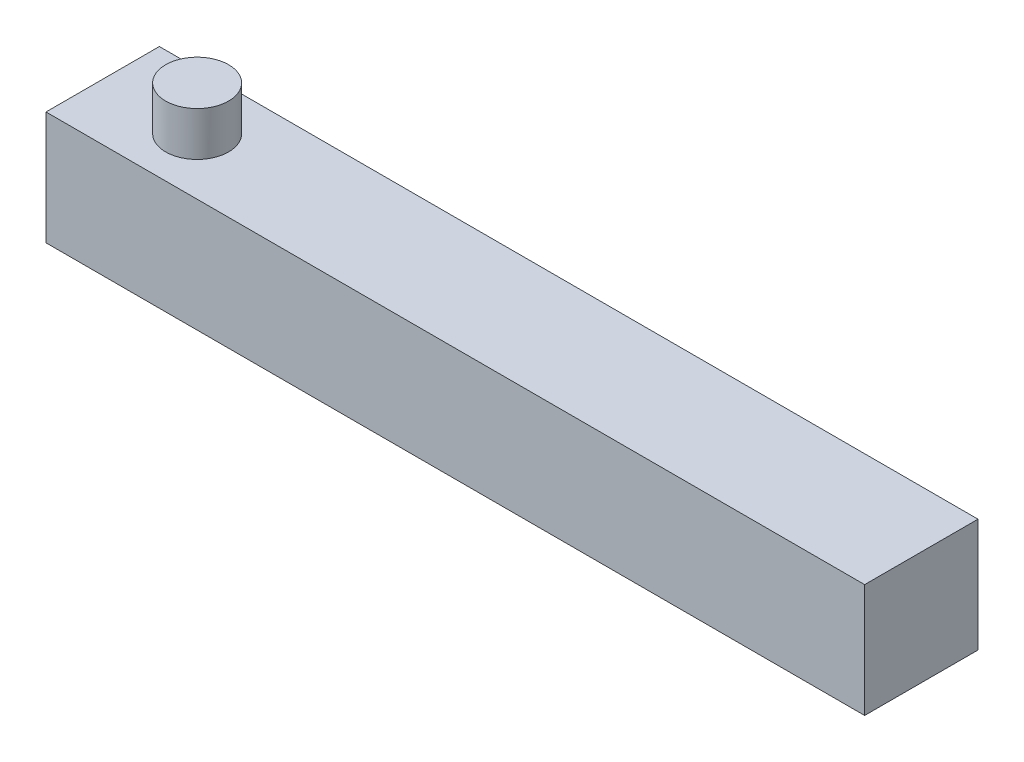
ISO-10303-21;
HEADER;
FILE_DESCRIPTION(('STEP AP214'),'2;1');
FILE_NAME('part.step','',(''),(''),'','','');
FILE_SCHEMA(('AUTOMOTIVE_DESIGN { 1 0 10303 214 1 1 1 1 }'));
ENDSEC;
DATA;
#1=APPLICATION_CONTEXT('core data for automotive mechanical design processes');
#2=APPLICATION_PROTOCOL_DEFINITION('international standard','automotive_design',2000,#1);
#3=PRODUCT_CONTEXT('',#1,'mechanical');
#4=PRODUCT('Part','Part','',(#3));
#5=PRODUCT_RELATED_PRODUCT_CATEGORY('part','',(#4));
#6=PRODUCT_DEFINITION_FORMATION('','',#4);
#7=PRODUCT_DEFINITION_CONTEXT('part definition',#1,'design');
#8=PRODUCT_DEFINITION('design','',#6,#7);
#9=PRODUCT_DEFINITION_SHAPE('','',#8);
#10=(LENGTH_UNIT() NAMED_UNIT(*) SI_UNIT(.MILLI.,.METRE.));
#11=(NAMED_UNIT(*) PLANE_ANGLE_UNIT() SI_UNIT($,.RADIAN.));
#12=(NAMED_UNIT(*) SI_UNIT($,.STERADIAN.) SOLID_ANGLE_UNIT());
#13=UNCERTAINTY_MEASURE_WITH_UNIT(LENGTH_MEASURE(1.E-05),#10,'distance_accuracy_value','');
#14=(GEOMETRIC_REPRESENTATION_CONTEXT(3) GLOBAL_UNCERTAINTY_ASSIGNED_CONTEXT((#13)) GLOBAL_UNIT_ASSIGNED_CONTEXT((#10,
#11,#12)) REPRESENTATION_CONTEXT('',''));
#15=CARTESIAN_POINT('',(0.,0.,0.));
#16=DIRECTION('',(0.,0.,1.));
#17=DIRECTION('',(1.,0.,0.));
#18=AXIS2_PLACEMENT_3D('',#15,#16,#17);
#19=CARTESIAN_POINT('',(32.5,9.,4.5));
#20=DIRECTION('',(-1.,0.,0.));
#21=DIRECTION('',(0.,0.,1.));
#22=AXIS2_PLACEMENT_3D('',#19,#20,#21);
#23=PLANE('',#22);
#24=DIRECTION('',(0.,0.,-1.));
#25=VECTOR('',#24,1.);
#26=CARTESIAN_POINT('',(32.5,0.,4.5));
#27=LINE('',#26,#25);
#28=CARTESIAN_POINT('',(32.5,0.,4.5));
#29=VERTEX_POINT('',#28);
#30=CARTESIAN_POINT('',(32.5,0.,-4.5));
#31=VERTEX_POINT('',#30);
#32=EDGE_CURVE('E103',#29,#31,#27,.T.);
#33=ORIENTED_EDGE('',*,*,#32,.T.);
#34=DIRECTION('',(0.,-1.,0.));
#35=VECTOR('',#34,1.);
#36=CARTESIAN_POINT('',(32.5,9.,-4.5));
#37=LINE('',#36,#35);
#38=CARTESIAN_POINT('',(32.5,9.,-4.5));
#39=VERTEX_POINT('',#38);
#40=EDGE_CURVE('E45',#39,#31,#37,.T.);
#41=ORIENTED_EDGE('',*,*,#40,.F.);
#42=DIRECTION('',(0.,0.,-1.));
#43=VECTOR('',#42,1.);
#44=CARTESIAN_POINT('',(32.5,9.,4.5));
#45=LINE('',#44,#43);
#46=CARTESIAN_POINT('',(32.5,9.,4.5));
#47=VERTEX_POINT('',#46);
#48=EDGE_CURVE('E89',#47,#39,#45,.T.);
#49=ORIENTED_EDGE('',*,*,#48,.F.);
#50=DIRECTION('',(0.,-1.,0.));
#51=VECTOR('',#50,1.);
#52=CARTESIAN_POINT('',(32.5,9.,4.5));
#53=LINE('',#52,#51);
#54=EDGE_CURVE('E99',#47,#29,#53,.T.);
#55=ORIENTED_EDGE('',*,*,#54,.T.);
#56=EDGE_LOOP('',(#33,#41,#49,#55));
#57=FACE_BOUND('',#56,.T.);
#58=ADVANCED_FACE('F37',(#57),#23,.F.);
#59=CARTESIAN_POINT('',(-32.5,9.,-4.5));
#60=DIRECTION('',(0.,0.,1.));
#61=DIRECTION('',(1.,0.,0.));
#62=AXIS2_PLACEMENT_3D('',#59,#60,#61);
#63=PLANE('',#62);
#64=DIRECTION('',(-1.,0.,0.));
#65=VECTOR('',#64,1.);
#66=CARTESIAN_POINT('',(-32.5,0.,-4.5));
#67=LINE('',#66,#65);
#68=CARTESIAN_POINT('',(-32.5,0.,-4.5));
#69=VERTEX_POINT('',#68);
#70=EDGE_CURVE('E94',#31,#69,#67,.T.);
#71=ORIENTED_EDGE('',*,*,#70,.T.);
#72=DIRECTION('',(0.,-1.,0.));
#73=VECTOR('',#72,1.);
#74=CARTESIAN_POINT('',(-32.5,9.,-4.5));
#75=LINE('',#74,#73);
#76=CARTESIAN_POINT('',(-32.5,9.,-4.5));
#77=VERTEX_POINT('',#76);
#78=EDGE_CURVE('E92',#77,#69,#75,.T.);
#79=ORIENTED_EDGE('',*,*,#78,.F.);
#80=DIRECTION('',(-1.,0.,0.));
#81=VECTOR('',#80,1.);
#82=CARTESIAN_POINT('',(-32.5,9.,-4.5));
#83=LINE('',#82,#81);
#84=EDGE_CURVE('E84',#39,#77,#83,.T.);
#85=ORIENTED_EDGE('',*,*,#84,.F.);
#86=ORIENTED_EDGE('',*,*,#40,.T.);
#87=EDGE_LOOP('',(#71,#79,#85,#86));
#88=FACE_BOUND('',#87,.T.);
#89=ADVANCED_FACE('F93',(#88),#63,.F.);
#90=CARTESIAN_POINT('',(-32.5,9.,4.5));
#91=DIRECTION('',(1.,0.,0.));
#92=DIRECTION('',(0.,0.,-1.));
#93=AXIS2_PLACEMENT_3D('',#90,#91,#92);
#94=PLANE('',#93);
#95=DIRECTION('',(0.,0.,1.));
#96=VECTOR('',#95,1.);
#97=CARTESIAN_POINT('',(-32.5,0.,4.5));
#98=LINE('',#97,#96);
#99=CARTESIAN_POINT('',(-32.5,0.,4.5));
#100=VERTEX_POINT('',#99);
#101=EDGE_CURVE('E70',#69,#100,#98,.T.);
#102=ORIENTED_EDGE('',*,*,#101,.T.);
#103=DIRECTION('',(0.,-1.,0.));
#104=VECTOR('',#103,1.);
#105=CARTESIAN_POINT('',(-32.5,9.,4.5));
#106=LINE('',#105,#104);
#107=CARTESIAN_POINT('',(-32.5,9.,4.5));
#108=VERTEX_POINT('',#107);
#109=EDGE_CURVE('E95',#108,#100,#106,.T.);
#110=ORIENTED_EDGE('',*,*,#109,.F.);
#111=DIRECTION('',(0.,0.,1.));
#112=VECTOR('',#111,1.);
#113=CARTESIAN_POINT('',(-32.5,9.,4.5));
#114=LINE('',#113,#112);
#115=EDGE_CURVE('E87',#77,#108,#114,.T.);
#116=ORIENTED_EDGE('',*,*,#115,.F.);
#117=ORIENTED_EDGE('',*,*,#78,.T.);
#118=EDGE_LOOP('',(#102,#110,#116,#117));
#119=FACE_BOUND('',#118,.T.);
#120=ADVANCED_FACE('F97',(#119),#94,.F.);
#121=CARTESIAN_POINT('',(-32.5,9.,4.5));
#122=DIRECTION('',(0.,0.,-1.));
#123=DIRECTION('',(-1.,0.,0.));
#124=AXIS2_PLACEMENT_3D('',#121,#122,#123);
#125=PLANE('',#124);
#126=DIRECTION('',(1.,0.,0.));
#127=VECTOR('',#126,1.);
#128=CARTESIAN_POINT('',(-32.5,0.,4.5));
#129=LINE('',#128,#127);
#130=EDGE_CURVE('E76',#100,#29,#129,.T.);
#131=ORIENTED_EDGE('',*,*,#130,.T.);
#132=ORIENTED_EDGE('',*,*,#54,.F.);
#133=DIRECTION('',(1.,0.,0.));
#134=VECTOR('',#133,1.);
#135=CARTESIAN_POINT('',(-32.5,9.,4.5));
#136=LINE('',#135,#134);
#137=EDGE_CURVE('E53',#108,#47,#136,.T.);
#138=ORIENTED_EDGE('',*,*,#137,.F.);
#139=ORIENTED_EDGE('',*,*,#109,.T.);
#140=EDGE_LOOP('',(#131,#132,#138,#139));
#141=FACE_BOUND('',#140,.T.);
#142=ADVANCED_FACE('F125',(#141),#125,.F.);
#143=CARTESIAN_POINT('',(0.,9.,0.));
#144=DIRECTION('',(0.,-1.,0.));
#145=DIRECTION('',(0.,0.,-1.));
#146=AXIS2_PLACEMENT_3D('',#143,#144,#145);
#147=PLANE('',#146);
#148=CARTESIAN_POINT('',(-25.,9.,0.));
#149=DIRECTION('',(0.,-1.,0.));
#150=DIRECTION('',(0.,0.,-1.));
#151=AXIS2_PLACEMENT_3D('',#148,#149,#150);
#152=CIRCLE('',#151,2.5);
#153=CARTESIAN_POINT('',(-25.,9.,-2.5));
#154=VERTEX_POINT('',#153);
#155=EDGE_CURVE('E11',#154,#154,#152,.F.);
#156=ORIENTED_EDGE('',*,*,#155,.F.);
#157=EDGE_LOOP('',(#156));
#158=FACE_BOUND('',#157,.T.);
#159=ORIENTED_EDGE('',*,*,#48,.T.);
#160=ORIENTED_EDGE('',*,*,#84,.T.);
#161=ORIENTED_EDGE('',*,*,#115,.T.);
#162=ORIENTED_EDGE('',*,*,#137,.T.);
#163=EDGE_LOOP('',(#159,#160,#161,#162));
#164=FACE_BOUND('',#163,.T.);
#165=ADVANCED_FACE('F85',(#158,#164),#147,.F.);
#166=CARTESIAN_POINT('',(0.,0.,0.));
#167=DIRECTION('',(0.,-1.,0.));
#168=DIRECTION('',(0.,0.,-1.));
#169=AXIS2_PLACEMENT_3D('',#166,#167,#168);
#170=PLANE('',#169);
#171=ORIENTED_EDGE('',*,*,#32,.F.);
#172=ORIENTED_EDGE('',*,*,#130,.F.);
#173=ORIENTED_EDGE('',*,*,#101,.F.);
#174=ORIENTED_EDGE('',*,*,#70,.F.);
#175=EDGE_LOOP('',(#171,#172,#173,#174));
#176=FACE_BOUND('',#175,.T.);
#177=ADVANCED_FACE('F114',(#176),#170,.T.);
#178=CARTESIAN_POINT('',(-25.,12.5,0.));
#179=DIRECTION('',(0.,-1.,0.));
#180=DIRECTION('',(0.,0.,-1.));
#181=AXIS2_PLACEMENT_3D('',#178,#179,#180);
#182=CYLINDRICAL_SURFACE('',#181,2.5);
#183=CARTESIAN_POINT('',(-25.,12.5,0.));
#184=DIRECTION('',(0.,1.,0.));
#185=DIRECTION('',(0.,0.,1.));
#186=AXIS2_PLACEMENT_3D('',#183,#184,#185);
#187=CIRCLE('',#186,2.5);
#188=CARTESIAN_POINT('',(-25.,12.5,2.5));
#189=VERTEX_POINT('',#188);
#190=EDGE_CURVE('E106',#189,#189,#187,.T.);
#191=ORIENTED_EDGE('',*,*,#190,.F.);
#192=EDGE_LOOP('',(#191));
#193=FACE_BOUND('',#192,.T.);
#194=ORIENTED_EDGE('',*,*,#155,.T.);
#195=EDGE_LOOP('',(#194));
#196=FACE_BOUND('',#195,.T.);
#197=ADVANCED_FACE('F116',(#193,#196),#182,.T.);
#198=CARTESIAN_POINT('',(0.,12.5,0.));
#199=DIRECTION('',(0.,1.,0.));
#200=DIRECTION('',(0.,0.,1.));
#201=AXIS2_PLACEMENT_3D('',#198,#199,#200);
#202=PLANE('',#201);
#203=ORIENTED_EDGE('',*,*,#190,.T.);
#204=EDGE_LOOP('',(#203));
#205=FACE_BOUND('',#204,.T.);
#206=ADVANCED_FACE('F122',(#205),#202,.T.);
#207=CLOSED_SHELL('',(#58,#89,#120,#142,#165,#177,#197,#206));
#208=MANIFOLD_SOLID_BREP('B2',#207);
#209=ADVANCED_BREP_SHAPE_REPRESENTATION('',(#18,#208),#14);
#210=SHAPE_DEFINITION_REPRESENTATION(#9,#209);
ENDSEC;
END-ISO-10303-21;
